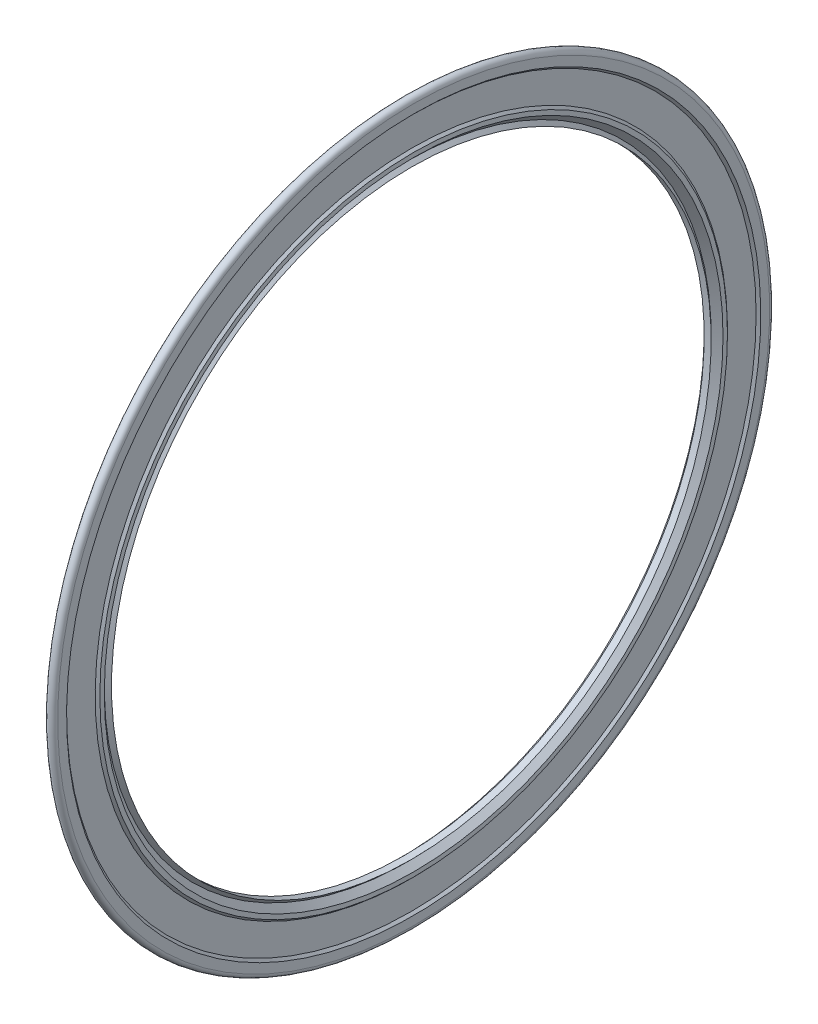
ISO-10303-21;
HEADER;
FILE_DESCRIPTION(('STEP AP214'),'2;1');
FILE_NAME('part.step','',(''),(''),'','','');
FILE_SCHEMA(('AUTOMOTIVE_DESIGN { 1 0 10303 214 1 1 1 1 }'));
ENDSEC;
DATA;
#1=APPLICATION_CONTEXT('core data for automotive mechanical design processes');
#2=APPLICATION_PROTOCOL_DEFINITION('international standard','automotive_design',2000,#1);
#3=PRODUCT_CONTEXT('',#1,'mechanical');
#4=PRODUCT('Part','Part','',(#3));
#5=PRODUCT_RELATED_PRODUCT_CATEGORY('part','',(#4));
#6=PRODUCT_DEFINITION_FORMATION('','',#4);
#7=PRODUCT_DEFINITION_CONTEXT('part definition',#1,'design');
#8=PRODUCT_DEFINITION('design','',#6,#7);
#9=PRODUCT_DEFINITION_SHAPE('','',#8);
#10=(LENGTH_UNIT() NAMED_UNIT(*) SI_UNIT(.MILLI.,.METRE.));
#11=(NAMED_UNIT(*) PLANE_ANGLE_UNIT() SI_UNIT($,.RADIAN.));
#12=(NAMED_UNIT(*) SI_UNIT($,.STERADIAN.) SOLID_ANGLE_UNIT());
#13=UNCERTAINTY_MEASURE_WITH_UNIT(LENGTH_MEASURE(1.E-05),#10,'distance_accuracy_value','');
#14=(GEOMETRIC_REPRESENTATION_CONTEXT(3) GLOBAL_UNCERTAINTY_ASSIGNED_CONTEXT((#13)) GLOBAL_UNIT_ASSIGNED_CONTEXT((#10,
#11,#12)) REPRESENTATION_CONTEXT('',''));
#15=CARTESIAN_POINT('',(0.,0.,0.));
#16=DIRECTION('',(0.,0.,1.));
#17=DIRECTION('',(1.,0.,0.));
#18=AXIS2_PLACEMENT_3D('',#15,#16,#17);
#19=CARTESIAN_POINT('',(11.78,33.26365,0.));
#20=DIRECTION('',(1.,0.,0.));
#21=DIRECTION('',(0.,-1.,0.));
#22=AXIS2_PLACEMENT_3D('',#19,#20,#21);
#23=PLANE('',#22);
#24=CARTESIAN_POINT('',(11.78,0.,0.));
#25=DIRECTION('',(-1.,0.,0.));
#26=DIRECTION('',(0.,1.,0.));
#27=AXIS2_PLACEMENT_3D('',#24,#25,#26);
#28=CIRCLE('',#27,32.84365);
#29=CARTESIAN_POINT('',(11.78,32.84365,0.));
#30=VERTEX_POINT('',#29);
#31=EDGE_CURVE('E11',#30,#30,#28,.T.);
#32=ORIENTED_EDGE('',*,*,#31,.T.);
#33=EDGE_LOOP('',(#32));
#34=FACE_BOUND('',#33,.T.);
#35=CARTESIAN_POINT('',(11.78,0.,0.));
#36=DIRECTION('',(-1.,0.,0.));
#37=DIRECTION('',(0.,1.,0.));
#38=AXIS2_PLACEMENT_3D('',#35,#36,#37);
#39=CIRCLE('',#38,33.68365);
#40=CARTESIAN_POINT('',(11.78,33.68365,0.));
#41=VERTEX_POINT('',#40);
#42=EDGE_CURVE('E72',#41,#41,#39,.T.);
#43=ORIENTED_EDGE('',*,*,#42,.F.);
#44=EDGE_LOOP('',(#43));
#45=FACE_BOUND('',#44,.T.);
#46=ADVANCED_FACE('F16',(#34,#45),#23,.T.);
#47=CARTESIAN_POINT('',(11.67,0.,0.));
#48=DIRECTION('',(1.,0.,0.));
#49=DIRECTION('',(0.,1.,0.));
#50=AXIS2_PLACEMENT_3D('',#47,#48,#49);
#51=CONICAL_SURFACE('',#50,32.73365,0.785398163397461);
#52=CARTESIAN_POINT('',(11.56,0.,0.));
#53=DIRECTION('',(-1.,0.,0.));
#54=DIRECTION('',(0.,1.,0.));
#55=AXIS2_PLACEMENT_3D('',#52,#53,#54);
#56=CIRCLE('',#55,32.62365);
#57=CARTESIAN_POINT('',(11.56,32.62365,0.));
#58=VERTEX_POINT('',#57);
#59=EDGE_CURVE('E26',#58,#58,#56,.T.);
#60=ORIENTED_EDGE('',*,*,#59,.T.);
#61=EDGE_LOOP('',(#60));
#62=FACE_BOUND('',#61,.T.);
#63=ORIENTED_EDGE('',*,*,#31,.F.);
#64=EDGE_LOOP('',(#63));
#65=FACE_BOUND('',#64,.T.);
#66=ADVANCED_FACE('F112',(#62,#65),#51,.F.);
#67=CARTESIAN_POINT('',(11.56,31.26865,0.));
#68=DIRECTION('',(1.,0.,0.));
#69=DIRECTION('',(0.,-1.,0.));
#70=AXIS2_PLACEMENT_3D('',#67,#68,#69);
#71=PLANE('',#70);
#72=CARTESIAN_POINT('',(11.56,0.,0.));
#73=DIRECTION('',(-1.,0.,0.));
#74=DIRECTION('',(0.,1.,0.));
#75=AXIS2_PLACEMENT_3D('',#72,#73,#74);
#76=CIRCLE('',#75,29.91365);
#77=CARTESIAN_POINT('',(11.56,29.91365,0.));
#78=VERTEX_POINT('',#77);
#79=EDGE_CURVE('E20',#78,#78,#76,.T.);
#80=ORIENTED_EDGE('',*,*,#79,.T.);
#81=EDGE_LOOP('',(#80));
#82=FACE_BOUND('',#81,.T.);
#83=ORIENTED_EDGE('',*,*,#59,.F.);
#84=EDGE_LOOP('',(#83));
#85=FACE_BOUND('',#84,.T.);
#86=ADVANCED_FACE('F98',(#82,#85),#71,.T.);
#87=CARTESIAN_POINT('',(11.67,0.,0.));
#88=DIRECTION('',(-1.,0.,0.));
#89=DIRECTION('',(0.,1.,0.));
#90=AXIS2_PLACEMENT_3D('',#87,#88,#89);
#91=CONICAL_SURFACE('',#90,29.80365,0.785398163397445);
#92=CARTESIAN_POINT('',(11.78,0.,0.));
#93=DIRECTION('',(-1.,0.,0.));
#94=DIRECTION('',(0.,1.,0.));
#95=AXIS2_PLACEMENT_3D('',#92,#93,#94);
#96=CIRCLE('',#95,29.69365);
#97=CARTESIAN_POINT('',(11.78,29.69365,0.));
#98=VERTEX_POINT('',#97);
#99=EDGE_CURVE('E81',#98,#98,#96,.T.);
#100=ORIENTED_EDGE('',*,*,#99,.T.);
#101=EDGE_LOOP('',(#100));
#102=FACE_BOUND('',#101,.T.);
#103=ORIENTED_EDGE('',*,*,#79,.F.);
#104=EDGE_LOOP('',(#103));
#105=FACE_BOUND('',#104,.T.);
#106=ADVANCED_FACE('F101',(#102,#105),#91,.T.);
#107=CARTESIAN_POINT('',(11.78,29.48365,0.));
#108=DIRECTION('',(1.,0.,0.));
#109=DIRECTION('',(0.,-1.,0.));
#110=AXIS2_PLACEMENT_3D('',#107,#108,#109);
#111=PLANE('',#110);
#112=CARTESIAN_POINT('',(11.78,0.,0.));
#113=DIRECTION('',(-1.,0.,0.));
#114=DIRECTION('',(0.,1.,0.));
#115=AXIS2_PLACEMENT_3D('',#112,#113,#114);
#116=CIRCLE('',#115,29.27365);
#117=CARTESIAN_POINT('',(11.78,29.27365,0.));
#118=VERTEX_POINT('',#117);
#119=EDGE_CURVE('E79',#118,#118,#116,.T.);
#120=ORIENTED_EDGE('',*,*,#119,.T.);
#121=EDGE_LOOP('',(#120));
#122=FACE_BOUND('',#121,.T.);
#123=ORIENTED_EDGE('',*,*,#99,.F.);
#124=EDGE_LOOP('',(#123));
#125=FACE_BOUND('',#124,.T.);
#126=ADVANCED_FACE('F18',(#122,#125),#111,.T.);
#127=CARTESIAN_POINT('',(11.4994875,0.,0.));
#128=DIRECTION('',(1.,0.,0.));
#129=DIRECTION('',(0.,1.,0.));
#130=AXIS2_PLACEMENT_3D('',#127,#128,#129);
#131=CONICAL_SURFACE('',#130,28.9931375,0.78539816339745);
#132=CARTESIAN_POINT('',(11.218975,0.,0.));
#133=DIRECTION('',(-1.,0.,0.));
#134=DIRECTION('',(0.,1.,0.));
#135=AXIS2_PLACEMENT_3D('',#132,#133,#134);
#136=CIRCLE('',#135,28.712625);
#137=CARTESIAN_POINT('',(11.218975,28.712625,0.));
#138=VERTEX_POINT('',#137);
#139=EDGE_CURVE('E82',#138,#138,#136,.T.);
#140=ORIENTED_EDGE('',*,*,#139,.T.);
#141=EDGE_LOOP('',(#140));
#142=FACE_BOUND('',#141,.T.);
#143=ORIENTED_EDGE('',*,*,#119,.F.);
#144=EDGE_LOOP('',(#143));
#145=FACE_BOUND('',#144,.T.);
#146=ADVANCED_FACE('F110',(#142,#145),#131,.F.);
#147=CARTESIAN_POINT('',(11.3894875,0.,0.));
#148=DIRECTION('',(-1.,0.,0.));
#149=DIRECTION('',(0.,1.,0.));
#150=AXIS2_PLACEMENT_3D('',#147,#148,#149);
#151=CONICAL_SURFACE('',#150,28.5421125,0.785398163397448);
#152=CARTESIAN_POINT('',(11.56,0.,0.));
#153=DIRECTION('',(-1.,0.,0.));
#154=DIRECTION('',(0.,1.,0.));
#155=AXIS2_PLACEMENT_3D('',#152,#153,#154);
#156=CIRCLE('',#155,28.3716);
#157=CARTESIAN_POINT('',(11.56,28.3716,0.));
#158=VERTEX_POINT('',#157);
#159=EDGE_CURVE('E83',#158,#158,#156,.T.);
#160=ORIENTED_EDGE('',*,*,#159,.T.);
#161=EDGE_LOOP('',(#160));
#162=FACE_BOUND('',#161,.T.);
#163=ORIENTED_EDGE('',*,*,#139,.F.);
#164=EDGE_LOOP('',(#163));
#165=FACE_BOUND('',#164,.T.);
#166=ADVANCED_FACE('F137',(#162,#165),#151,.T.);
#167=CARTESIAN_POINT('',(11.23,0.,0.));
#168=DIRECTION('',(1.,0.,0.));
#169=DIRECTION('',(0.,1.,0.));
#170=AXIS2_PLACEMENT_3D('',#167,#168,#169);
#171=CYLINDRICAL_SURFACE('',#170,28.3716);
#172=CARTESIAN_POINT('',(10.9,0.,0.));
#173=DIRECTION('',(-1.,0.,0.));
#174=DIRECTION('',(0.,1.,0.));
#175=AXIS2_PLACEMENT_3D('',#172,#173,#174);
#176=CIRCLE('',#175,28.3716);
#177=CARTESIAN_POINT('',(10.9,28.3716,0.));
#178=VERTEX_POINT('',#177);
#179=EDGE_CURVE('E85',#178,#178,#176,.T.);
#180=ORIENTED_EDGE('',*,*,#179,.T.);
#181=EDGE_LOOP('',(#180));
#182=FACE_BOUND('',#181,.T.);
#183=ORIENTED_EDGE('',*,*,#159,.F.);
#184=EDGE_LOOP('',(#183));
#185=FACE_BOUND('',#184,.T.);
#186=ADVANCED_FACE('F134',(#182,#185),#171,.F.);
#187=CARTESIAN_POINT('',(10.7294875,0.,0.));
#188=DIRECTION('',(-1.,0.,0.));
#189=DIRECTION('',(0.,1.,0.));
#190=AXIS2_PLACEMENT_3D('',#187,#188,#189);
#191=CONICAL_SURFACE('',#190,28.5421125,0.785398163397443);
#192=CARTESIAN_POINT('',(10.558975,0.,0.));
#193=DIRECTION('',(-1.,0.,0.));
#194=DIRECTION('',(0.,1.,0.));
#195=AXIS2_PLACEMENT_3D('',#192,#193,#194);
#196=CIRCLE('',#195,28.712625);
#197=CARTESIAN_POINT('',(10.558975,28.712625,0.));
#198=VERTEX_POINT('',#197);
#199=EDGE_CURVE('E86',#198,#198,#196,.T.);
#200=ORIENTED_EDGE('',*,*,#199,.T.);
#201=EDGE_LOOP('',(#200));
#202=FACE_BOUND('',#201,.T.);
#203=ORIENTED_EDGE('',*,*,#179,.F.);
#204=EDGE_LOOP('',(#203));
#205=FACE_BOUND('',#204,.T.);
#206=ADVANCED_FACE('F136',(#202,#205),#191,.F.);
#207=CARTESIAN_POINT('',(10.8394875,0.,0.));
#208=DIRECTION('',(1.,0.,0.));
#209=DIRECTION('',(0.,1.,0.));
#210=AXIS2_PLACEMENT_3D('',#207,#208,#209);
#211=CONICAL_SURFACE('',#210,28.9931375,0.785398163397446);
#212=CARTESIAN_POINT('',(11.12,0.,0.));
#213=DIRECTION('',(-1.,0.,0.));
#214=DIRECTION('',(0.,1.,0.));
#215=AXIS2_PLACEMENT_3D('',#212,#213,#214);
#216=CIRCLE('',#215,29.27365);
#217=CARTESIAN_POINT('',(11.12,29.27365,0.));
#218=VERTEX_POINT('',#217);
#219=EDGE_CURVE('E78',#218,#218,#216,.T.);
#220=ORIENTED_EDGE('',*,*,#219,.T.);
#221=EDGE_LOOP('',(#220));
#222=FACE_BOUND('',#221,.T.);
#223=ORIENTED_EDGE('',*,*,#199,.F.);
#224=EDGE_LOOP('',(#223));
#225=FACE_BOUND('',#224,.T.);
#226=ADVANCED_FACE('F130',(#222,#225),#211,.T.);
#227=CARTESIAN_POINT('',(10.9,0.,0.));
#228=DIRECTION('',(-1.,0.,0.));
#229=DIRECTION('',(0.,1.,0.));
#230=AXIS2_PLACEMENT_3D('',#227,#228,#229);
#231=CONICAL_SURFACE('',#230,29.49365,0.785398163397445);
#232=CARTESIAN_POINT('',(10.68,0.,0.));
#233=DIRECTION('',(-1.,0.,0.));
#234=DIRECTION('',(0.,1.,0.));
#235=AXIS2_PLACEMENT_3D('',#232,#233,#234);
#236=CIRCLE('',#235,29.71365);
#237=CARTESIAN_POINT('',(10.68,29.71365,0.));
#238=VERTEX_POINT('',#237);
#239=EDGE_CURVE('E76',#238,#238,#236,.T.);
#240=ORIENTED_EDGE('',*,*,#239,.T.);
#241=EDGE_LOOP('',(#240));
#242=FACE_BOUND('',#241,.T.);
#243=ORIENTED_EDGE('',*,*,#219,.F.);
#244=EDGE_LOOP('',(#243));
#245=FACE_BOUND('',#244,.T.);
#246=ADVANCED_FACE('F126',(#242,#245),#231,.F.);
#247=CARTESIAN_POINT('',(10.68,31.0940565058178,0.));
#248=DIRECTION('',(-1.,0.,0.));
#249=DIRECTION('',(0.,1.,0.));
#250=AXIS2_PLACEMENT_3D('',#247,#248,#249);
#251=PLANE('',#250);
#252=CARTESIAN_POINT('',(10.68,0.,0.));
#253=DIRECTION('',(-1.,0.,0.));
#254=DIRECTION('',(0.,1.,0.));
#255=AXIS2_PLACEMENT_3D('',#252,#253,#254);
#256=CIRCLE('',#255,32.4744630116355);
#257=CARTESIAN_POINT('',(10.68,32.4744630116355,0.));
#258=VERTEX_POINT('',#257);
#259=EDGE_CURVE('E74',#258,#258,#256,.T.);
#260=ORIENTED_EDGE('',*,*,#259,.T.);
#261=EDGE_LOOP('',(#260));
#262=FACE_BOUND('',#261,.T.);
#263=ORIENTED_EDGE('',*,*,#239,.F.);
#264=EDGE_LOOP('',(#263));
#265=FACE_BOUND('',#264,.T.);
#266=ADVANCED_FACE('F123',(#262,#265),#251,.T.);
#267=CARTESIAN_POINT('',(10.7933422943373,0.,0.));
#268=DIRECTION('',(1.,0.,0.));
#269=DIRECTION('',(0.,1.,0.));
#270=AXIS2_PLACEMENT_3D('',#267,#268,#269);
#271=CONICAL_SURFACE('',#270,33.1172591049045,1.39626340159546);
#272=CARTESIAN_POINT('',(10.9066845886746,0.,0.));
#273=DIRECTION('',(-1.,0.,0.));
#274=DIRECTION('',(0.,1.,0.));
#275=AXIS2_PLACEMENT_3D('',#272,#273,#274);
#276=CIRCLE('',#275,33.7600551981734);
#277=CARTESIAN_POINT('',(10.9066845886746,33.7600551981734,0.));
#278=VERTEX_POINT('',#277);
#279=EDGE_CURVE('E68',#278,#278,#276,.T.);
#280=ORIENTED_EDGE('',*,*,#279,.T.);
#281=EDGE_LOOP('',(#280));
#282=FACE_BOUND('',#281,.T.);
#283=ORIENTED_EDGE('',*,*,#259,.F.);
#284=EDGE_LOOP('',(#283));
#285=FACE_BOUND('',#284,.T.);
#286=ADVANCED_FACE('F69',(#282,#285),#271,.T.);
#287=CARTESIAN_POINT('',(11.34,0.,0.));
#288=DIRECTION('',(-1.,0.,0.));
#289=DIRECTION('',(0.,0.,1.));
#290=AXIS2_PLACEMENT_3D('',#287,#288,#289);
#291=TOROIDAL_SURFACE('',#290,33.68365,0.44);
#292=ORIENTED_EDGE('',*,*,#42,.T.);
#293=EDGE_LOOP('',(#292));
#294=FACE_BOUND('',#293,.T.);
#295=ORIENTED_EDGE('',*,*,#279,.F.);
#296=EDGE_LOOP('',(#295));
#297=FACE_BOUND('',#296,.T.);
#298=ADVANCED_FACE('F133',(#294,#297),#291,.T.);
#299=CLOSED_SHELL('',(#46,#66,#86,#106,#126,#146,#166,#186,#206,#226,#246,#266,#286,#298));
#300=MANIFOLD_SOLID_BREP('B1',#299);
#301=ADVANCED_BREP_SHAPE_REPRESENTATION('',(#18,#300),#14);
#302=SHAPE_DEFINITION_REPRESENTATION(#9,#301);
ENDSEC;
END-ISO-10303-21;
